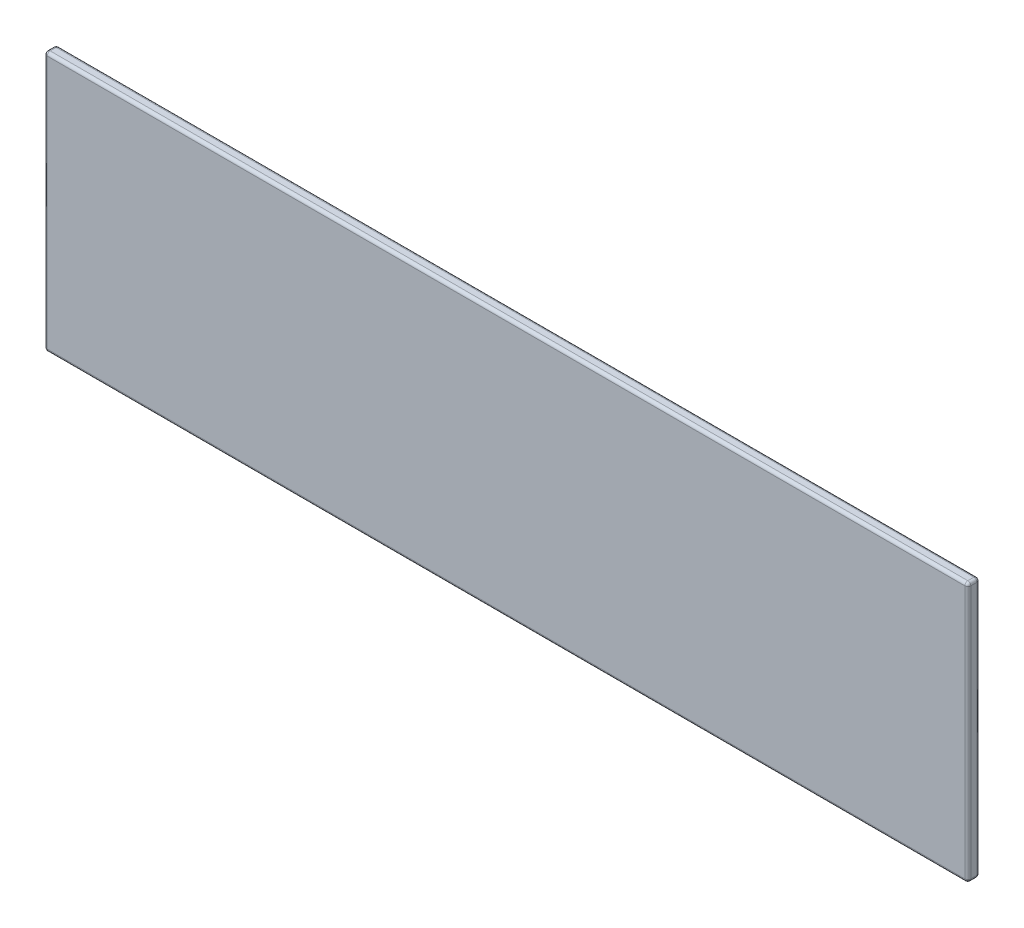
ISO-10303-21;
HEADER;
FILE_DESCRIPTION(('STEP AP214'),'2;1');
FILE_NAME('part.step','',(''),(''),'','','');
FILE_SCHEMA(('AUTOMOTIVE_DESIGN { 1 0 10303 214 1 1 1 1 }'));
ENDSEC;
DATA;
#1=APPLICATION_CONTEXT('core data for automotive mechanical design processes');
#2=APPLICATION_PROTOCOL_DEFINITION('international standard','automotive_design',2000,#1);
#3=PRODUCT_CONTEXT('',#1,'mechanical');
#4=PRODUCT('Part','Part','',(#3));
#5=PRODUCT_RELATED_PRODUCT_CATEGORY('part','',(#4));
#6=PRODUCT_DEFINITION_FORMATION('','',#4);
#7=PRODUCT_DEFINITION_CONTEXT('part definition',#1,'design');
#8=PRODUCT_DEFINITION('design','',#6,#7);
#9=PRODUCT_DEFINITION_SHAPE('','',#8);
#10=(LENGTH_UNIT() NAMED_UNIT(*) SI_UNIT(.MILLI.,.METRE.));
#11=(NAMED_UNIT(*) PLANE_ANGLE_UNIT() SI_UNIT($,.RADIAN.));
#12=(NAMED_UNIT(*) SI_UNIT($,.STERADIAN.) SOLID_ANGLE_UNIT());
#13=UNCERTAINTY_MEASURE_WITH_UNIT(LENGTH_MEASURE(1.E-05),#10,'distance_accuracy_value','');
#14=(GEOMETRIC_REPRESENTATION_CONTEXT(3) GLOBAL_UNCERTAINTY_ASSIGNED_CONTEXT((#13)) GLOBAL_UNIT_ASSIGNED_CONTEXT((#10,
#11,#12)) REPRESENTATION_CONTEXT('',''));
#15=CARTESIAN_POINT('',(0.,0.,0.));
#16=DIRECTION('',(0.,0.,1.));
#17=DIRECTION('',(1.,0.,0.));
#18=AXIS2_PLACEMENT_3D('',#15,#16,#17);
#19=CARTESIAN_POINT('',(77.35,-21.75,2.));
#20=DIRECTION('',(-1.,0.,0.));
#21=DIRECTION('',(0.,0.,1.));
#22=AXIS2_PLACEMENT_3D('',#19,#20,#21);
#23=PLANE('',#22);
#24=DIRECTION('',(0.,1.,0.));
#25=VECTOR('',#24,1.);
#26=CARTESIAN_POINT('',(77.35,-21.75,1.5));
#27=LINE('',#26,#25);
#28=CARTESIAN_POINT('',(77.35,21.25,1.5));
#29=VERTEX_POINT('',#28);
#30=CARTESIAN_POINT('',(77.35,-21.25,1.5));
#31=VERTEX_POINT('',#30);
#32=EDGE_CURVE('E42',#29,#31,#27,.F.);
#33=ORIENTED_EDGE('',*,*,#32,.T.);
#34=DIRECTION('',(0.,0.,-1.));
#35=VECTOR('',#34,1.);
#36=CARTESIAN_POINT('',(77.35,-21.25,2.));
#37=LINE('',#36,#35);
#38=CARTESIAN_POINT('',(77.35,-21.25,0.5));
#39=VERTEX_POINT('',#38);
#40=EDGE_CURVE('E11',#31,#39,#37,.T.);
#41=ORIENTED_EDGE('',*,*,#40,.T.);
#42=DIRECTION('',(0.,1.,0.));
#43=VECTOR('',#42,1.);
#44=CARTESIAN_POINT('',(77.35,21.75,0.5));
#45=LINE('',#44,#43);
#46=CARTESIAN_POINT('',(77.35,21.25,0.5));
#47=VERTEX_POINT('',#46);
#48=EDGE_CURVE('E194',#39,#47,#45,.T.);
#49=ORIENTED_EDGE('',*,*,#48,.T.);
#50=DIRECTION('',(0.,0.,-1.));
#51=VECTOR('',#50,1.);
#52=CARTESIAN_POINT('',(77.35,21.25,2.));
#53=LINE('',#52,#51);
#54=EDGE_CURVE('E53',#47,#29,#53,.F.);
#55=ORIENTED_EDGE('',*,*,#54,.T.);
#56=EDGE_LOOP('',(#33,#41,#49,#55));
#57=FACE_BOUND('',#56,.T.);
#58=ADVANCED_FACE('F33',(#57),#23,.F.);
#59=CARTESIAN_POINT('',(-77.35,21.75,2.));
#60=DIRECTION('',(0.,-1.,0.));
#61=DIRECTION('',(0.,0.,-1.));
#62=AXIS2_PLACEMENT_3D('',#59,#60,#61);
#63=PLANE('',#62);
#64=DIRECTION('',(0.,0.,-1.));
#65=VECTOR('',#64,1.);
#66=CARTESIAN_POINT('',(-76.85,21.75,2.));
#67=LINE('',#66,#65);
#68=CARTESIAN_POINT('',(-76.85,21.75,0.5));
#69=VERTEX_POINT('',#68);
#70=CARTESIAN_POINT('',(-76.85,21.75,1.5));
#71=VERTEX_POINT('',#70);
#72=EDGE_CURVE('E189',#69,#71,#67,.F.);
#73=ORIENTED_EDGE('',*,*,#72,.T.);
#74=DIRECTION('',(-1.,0.,0.));
#75=VECTOR('',#74,1.);
#76=CARTESIAN_POINT('',(-77.35,21.75,1.5));
#77=LINE('',#76,#75);
#78=CARTESIAN_POINT('',(76.85,21.75,1.5));
#79=VERTEX_POINT('',#78);
#80=EDGE_CURVE('E191',#71,#79,#77,.F.);
#81=ORIENTED_EDGE('',*,*,#80,.T.);
#82=DIRECTION('',(0.,0.,-1.));
#83=VECTOR('',#82,1.);
#84=CARTESIAN_POINT('',(76.85,21.75,2.));
#85=LINE('',#84,#83);
#86=CARTESIAN_POINT('',(76.85,21.75,0.5));
#87=VERTEX_POINT('',#86);
#88=EDGE_CURVE('E185',#79,#87,#85,.T.);
#89=ORIENTED_EDGE('',*,*,#88,.T.);
#90=DIRECTION('',(-1.,0.,0.));
#91=VECTOR('',#90,1.);
#92=CARTESIAN_POINT('',(-77.35,21.75,0.5));
#93=LINE('',#92,#91);
#94=EDGE_CURVE('E187',#87,#69,#93,.T.);
#95=ORIENTED_EDGE('',*,*,#94,.T.);
#96=EDGE_LOOP('',(#73,#81,#89,#95));
#97=FACE_BOUND('',#96,.T.);
#98=ADVANCED_FACE('F278',(#97),#63,.F.);
#99=CARTESIAN_POINT('',(-77.35,-21.75,2.));
#100=DIRECTION('',(1.,0.,0.));
#101=DIRECTION('',(0.,0.,-1.));
#102=AXIS2_PLACEMENT_3D('',#99,#100,#101);
#103=PLANE('',#102);
#104=DIRECTION('',(0.,0.,-1.));
#105=VECTOR('',#104,1.);
#106=CARTESIAN_POINT('',(-77.35,-21.25,2.));
#107=LINE('',#106,#105);
#108=CARTESIAN_POINT('',(-77.35,-21.25,0.5));
#109=VERTEX_POINT('',#108);
#110=CARTESIAN_POINT('',(-77.35,-21.25,1.5));
#111=VERTEX_POINT('',#110);
#112=EDGE_CURVE('E180',#109,#111,#107,.F.);
#113=ORIENTED_EDGE('',*,*,#112,.T.);
#114=DIRECTION('',(0.,-1.,0.));
#115=VECTOR('',#114,1.);
#116=CARTESIAN_POINT('',(-77.35,-21.75,1.5));
#117=LINE('',#116,#115);
#118=CARTESIAN_POINT('',(-77.35,21.25,1.5));
#119=VERTEX_POINT('',#118);
#120=EDGE_CURVE('E182',#111,#119,#117,.F.);
#121=ORIENTED_EDGE('',*,*,#120,.T.);
#122=DIRECTION('',(0.,0.,-1.));
#123=VECTOR('',#122,1.);
#124=CARTESIAN_POINT('',(-77.35,21.25,2.));
#125=LINE('',#124,#123);
#126=CARTESIAN_POINT('',(-77.35,21.25,0.5));
#127=VERTEX_POINT('',#126);
#128=EDGE_CURVE('E176',#119,#127,#125,.T.);
#129=ORIENTED_EDGE('',*,*,#128,.T.);
#130=DIRECTION('',(0.,-1.,0.));
#131=VECTOR('',#130,1.);
#132=CARTESIAN_POINT('',(-77.35,-21.75,0.5));
#133=LINE('',#132,#131);
#134=EDGE_CURVE('E178',#127,#109,#133,.T.);
#135=ORIENTED_EDGE('',*,*,#134,.T.);
#136=EDGE_LOOP('',(#113,#121,#129,#135));
#137=FACE_BOUND('',#136,.T.);
#138=ADVANCED_FACE('F269',(#137),#103,.F.);
#139=CARTESIAN_POINT('',(-77.35,-21.75,2.));
#140=DIRECTION('',(0.,1.,0.));
#141=DIRECTION('',(0.,0.,1.));
#142=AXIS2_PLACEMENT_3D('',#139,#140,#141);
#143=PLANE('',#142);
#144=DIRECTION('',(1.,0.,0.));
#145=VECTOR('',#144,1.);
#146=CARTESIAN_POINT('',(-77.35,-21.75,1.5));
#147=LINE('',#146,#145);
#148=CARTESIAN_POINT('',(76.85,-21.75,1.5));
#149=VERTEX_POINT('',#148);
#150=CARTESIAN_POINT('',(-76.85,-21.75,1.5));
#151=VERTEX_POINT('',#150);
#152=EDGE_CURVE('E129',#149,#151,#147,.F.);
#153=ORIENTED_EDGE('',*,*,#152,.T.);
#154=DIRECTION('',(0.,0.,-1.));
#155=VECTOR('',#154,1.);
#156=CARTESIAN_POINT('',(-76.85,-21.75,2.));
#157=LINE('',#156,#155);
#158=CARTESIAN_POINT('',(-76.85,-21.75,0.5));
#159=VERTEX_POINT('',#158);
#160=EDGE_CURVE('E165',#151,#159,#157,.T.);
#161=ORIENTED_EDGE('',*,*,#160,.T.);
#162=DIRECTION('',(1.,0.,0.));
#163=VECTOR('',#162,1.);
#164=CARTESIAN_POINT('',(77.35,-21.75,0.5));
#165=LINE('',#164,#163);
#166=CARTESIAN_POINT('',(76.85,-21.75,0.5));
#167=VERTEX_POINT('',#166);
#168=EDGE_CURVE('E158',#159,#167,#165,.T.);
#169=ORIENTED_EDGE('',*,*,#168,.T.);
#170=DIRECTION('',(0.,0.,-1.));
#171=VECTOR('',#170,1.);
#172=CARTESIAN_POINT('',(76.85,-21.75,2.));
#173=LINE('',#172,#171);
#174=EDGE_CURVE('E156',#167,#149,#173,.F.);
#175=ORIENTED_EDGE('',*,*,#174,.T.);
#176=EDGE_LOOP('',(#153,#161,#169,#175));
#177=FACE_BOUND('',#176,.T.);
#178=ADVANCED_FACE('F356',(#177),#143,.F.);
#179=CARTESIAN_POINT('',(0.,0.,2.));
#180=DIRECTION('',(0.,0.,-1.));
#181=DIRECTION('',(-1.,0.,0.));
#182=AXIS2_PLACEMENT_3D('',#179,#180,#181);
#183=PLANE('',#182);
#184=DIRECTION('',(0.,-1.,0.));
#185=VECTOR('',#184,1.);
#186=CARTESIAN_POINT('',(-76.85,0.,2.));
#187=LINE('',#186,#185);
#188=CARTESIAN_POINT('',(-76.85,21.25,2.));
#189=VERTEX_POINT('',#188);
#190=CARTESIAN_POINT('',(-76.85,-21.25,2.));
#191=VERTEX_POINT('',#190);
#192=EDGE_CURVE('E154',#189,#191,#187,.T.);
#193=ORIENTED_EDGE('',*,*,#192,.T.);
#194=DIRECTION('',(1.,0.,0.));
#195=VECTOR('',#194,1.);
#196=CARTESIAN_POINT('',(0.,-21.25,2.));
#197=LINE('',#196,#195);
#198=CARTESIAN_POINT('',(76.85,-21.25,2.));
#199=VERTEX_POINT('',#198);
#200=EDGE_CURVE('E127',#191,#199,#197,.T.);
#201=ORIENTED_EDGE('',*,*,#200,.T.);
#202=DIRECTION('',(0.,1.,0.));
#203=VECTOR('',#202,1.);
#204=CARTESIAN_POINT('',(76.85,0.,2.));
#205=LINE('',#204,#203);
#206=CARTESIAN_POINT('',(76.85,21.25,2.));
#207=VERTEX_POINT('',#206);
#208=EDGE_CURVE('E144',#199,#207,#205,.T.);
#209=ORIENTED_EDGE('',*,*,#208,.T.);
#210=DIRECTION('',(-1.,0.,0.));
#211=VECTOR('',#210,1.);
#212=CARTESIAN_POINT('',(0.,21.25,2.));
#213=LINE('',#212,#211);
#214=EDGE_CURVE('E150',#207,#189,#213,.T.);
#215=ORIENTED_EDGE('',*,*,#214,.T.);
#216=EDGE_LOOP('',(#193,#201,#209,#215));
#217=FACE_BOUND('',#216,.T.);
#218=ADVANCED_FACE('F152',(#217),#183,.F.);
#219=CARTESIAN_POINT('',(0.,0.,0.));
#220=DIRECTION('',(0.,0.,-1.));
#221=DIRECTION('',(-1.,0.,0.));
#222=AXIS2_PLACEMENT_3D('',#219,#220,#221);
#223=PLANE('',#222);
#224=DIRECTION('',(0.,1.,0.));
#225=VECTOR('',#224,1.);
#226=CARTESIAN_POINT('',(76.85,-21.75,0.));
#227=LINE('',#226,#225);
#228=CARTESIAN_POINT('',(76.85,21.25,0.));
#229=VERTEX_POINT('',#228);
#230=CARTESIAN_POINT('',(76.85,-21.25,0.));
#231=VERTEX_POINT('',#230);
#232=EDGE_CURVE('E167',#229,#231,#227,.F.);
#233=ORIENTED_EDGE('',*,*,#232,.T.);
#234=DIRECTION('',(1.,0.,0.));
#235=VECTOR('',#234,1.);
#236=CARTESIAN_POINT('',(-77.35,-21.25,0.));
#237=LINE('',#236,#235);
#238=CARTESIAN_POINT('',(-76.85,-21.25,0.));
#239=VERTEX_POINT('',#238);
#240=EDGE_CURVE('E173',#231,#239,#237,.F.);
#241=ORIENTED_EDGE('',*,*,#240,.T.);
#242=DIRECTION('',(0.,-1.,0.));
#243=VECTOR('',#242,1.);
#244=CARTESIAN_POINT('',(-76.85,21.75,0.));
#245=LINE('',#244,#243);
#246=CARTESIAN_POINT('',(-76.85,21.25,0.));
#247=VERTEX_POINT('',#246);
#248=EDGE_CURVE('E171',#239,#247,#245,.F.);
#249=ORIENTED_EDGE('',*,*,#248,.T.);
#250=DIRECTION('',(-1.,0.,0.));
#251=VECTOR('',#250,1.);
#252=CARTESIAN_POINT('',(77.35,21.25,0.));
#253=LINE('',#252,#251);
#254=EDGE_CURVE('E169',#247,#229,#253,.F.);
#255=ORIENTED_EDGE('',*,*,#254,.T.);
#256=EDGE_LOOP('',(#233,#241,#249,#255));
#257=FACE_BOUND('',#256,.T.);
#258=ADVANCED_FACE('F296',(#257),#223,.T.);
#259=CARTESIAN_POINT('',(-77.35,21.25,0.5));
#260=DIRECTION('',(1.,0.,0.));
#261=DIRECTION('',(0.,0.,-1.));
#262=AXIS2_PLACEMENT_3D('',#259,#260,#261);
#263=CYLINDRICAL_SURFACE('',#262,0.5);
#264=CARTESIAN_POINT('',(-76.85,21.25,0.5));
#265=DIRECTION('',(-1.,0.,0.));
#266=DIRECTION('',(0.,0.,1.));
#267=AXIS2_PLACEMENT_3D('',#264,#265,#266);
#268=CIRCLE('',#267,0.5);
#269=EDGE_CURVE('E37',#69,#247,#268,.T.);
#270=ORIENTED_EDGE('',*,*,#269,.F.);
#271=ORIENTED_EDGE('',*,*,#94,.F.);
#272=CARTESIAN_POINT('',(76.85,21.25,0.5));
#273=DIRECTION('',(1.,0.,0.));
#274=DIRECTION('',(0.,0.,-1.));
#275=AXIS2_PLACEMENT_3D('',#272,#273,#274);
#276=CIRCLE('',#275,0.5);
#277=EDGE_CURVE('E246',#229,#87,#276,.T.);
#278=ORIENTED_EDGE('',*,*,#277,.F.);
#279=ORIENTED_EDGE('',*,*,#254,.F.);
#280=EDGE_LOOP('',(#270,#271,#278,#279));
#281=FACE_BOUND('',#280,.T.);
#282=ADVANCED_FACE('F35',(#281),#263,.T.);
#283=CARTESIAN_POINT('',(-76.85,21.25,0.5));
#284=DIRECTION('',(0.,0.,1.));
#285=DIRECTION('',(1.,0.,0.));
#286=AXIS2_PLACEMENT_3D('',#283,#284,#285);
#287=SPHERICAL_SURFACE('',#286,0.5);
#288=CARTESIAN_POINT('',(-76.85,21.25,0.5));
#289=DIRECTION('',(0.,0.,-1.));
#290=DIRECTION('',(-1.,0.,0.));
#291=AXIS2_PLACEMENT_3D('',#288,#289,#290);
#292=CIRCLE('',#291,0.5);
#293=EDGE_CURVE('E241',#69,#127,#292,.F.);
#294=ORIENTED_EDGE('',*,*,#293,.F.);
#295=ORIENTED_EDGE('',*,*,#269,.T.);
#296=CARTESIAN_POINT('',(-76.85,21.25,0.5));
#297=DIRECTION('',(0.,1.,0.));
#298=DIRECTION('',(0.,0.,1.));
#299=AXIS2_PLACEMENT_3D('',#296,#297,#298);
#300=CIRCLE('',#299,0.5);
#301=EDGE_CURVE('E244',#127,#247,#300,.F.);
#302=ORIENTED_EDGE('',*,*,#301,.F.);
#303=EDGE_LOOP('',(#294,#295,#302));
#304=FACE_BOUND('',#303,.T.);
#305=ADVANCED_FACE('F257',(#304),#287,.T.);
#306=CARTESIAN_POINT('',(76.85,21.25,0.5));
#307=DIRECTION('',(0.,0.,1.));
#308=DIRECTION('',(1.,0.,0.));
#309=AXIS2_PLACEMENT_3D('',#306,#307,#308);
#310=SPHERICAL_SURFACE('',#309,0.5);
#311=CARTESIAN_POINT('',(76.85,21.25,0.5));
#312=DIRECTION('',(0.,1.,0.));
#313=DIRECTION('',(0.,0.,1.));
#314=AXIS2_PLACEMENT_3D('',#311,#312,#313);
#315=CIRCLE('',#314,0.5);
#316=EDGE_CURVE('E235',#229,#47,#315,.F.);
#317=ORIENTED_EDGE('',*,*,#316,.F.);
#318=ORIENTED_EDGE('',*,*,#277,.T.);
#319=CARTESIAN_POINT('',(76.85,21.25,0.5));
#320=DIRECTION('',(0.,0.,-1.));
#321=DIRECTION('',(-1.,0.,0.));
#322=AXIS2_PLACEMENT_3D('',#319,#320,#321);
#323=CIRCLE('',#322,0.5);
#324=EDGE_CURVE('E238',#47,#87,#323,.F.);
#325=ORIENTED_EDGE('',*,*,#324,.F.);
#326=EDGE_LOOP('',(#317,#318,#325));
#327=FACE_BOUND('',#326,.T.);
#328=ADVANCED_FACE('F289',(#327),#310,.T.);
#329=CARTESIAN_POINT('',(-76.85,-21.75,0.5));
#330=DIRECTION('',(0.,1.,0.));
#331=DIRECTION('',(0.,0.,1.));
#332=AXIS2_PLACEMENT_3D('',#329,#330,#331);
#333=CYLINDRICAL_SURFACE('',#332,0.5);
#334=ORIENTED_EDGE('',*,*,#301,.T.);
#335=ORIENTED_EDGE('',*,*,#248,.F.);
#336=CARTESIAN_POINT('',(-76.85,-21.25,0.5));
#337=DIRECTION('',(0.,-1.,0.));
#338=DIRECTION('',(0.,0.,-1.));
#339=AXIS2_PLACEMENT_3D('',#336,#337,#338);
#340=CIRCLE('',#339,0.5);
#341=EDGE_CURVE('E230',#109,#239,#340,.T.);
#342=ORIENTED_EDGE('',*,*,#341,.F.);
#343=ORIENTED_EDGE('',*,*,#134,.F.);
#344=EDGE_LOOP('',(#334,#335,#342,#343));
#345=FACE_BOUND('',#344,.T.);
#346=ADVANCED_FACE('F265',(#345),#333,.T.);
#347=CARTESIAN_POINT('',(-76.85,21.25,2.));
#348=DIRECTION('',(0.,0.,-1.));
#349=DIRECTION('',(-1.,0.,0.));
#350=AXIS2_PLACEMENT_3D('',#347,#348,#349);
#351=CYLINDRICAL_SURFACE('',#350,0.5);
#352=ORIENTED_EDGE('',*,*,#293,.T.);
#353=ORIENTED_EDGE('',*,*,#128,.F.);
#354=CARTESIAN_POINT('',(-76.85,21.25,1.5));
#355=DIRECTION('',(0.,0.,1.));
#356=DIRECTION('',(1.,0.,0.));
#357=AXIS2_PLACEMENT_3D('',#354,#355,#356);
#358=CIRCLE('',#357,0.5);
#359=EDGE_CURVE('E227',#71,#119,#358,.T.);
#360=ORIENTED_EDGE('',*,*,#359,.F.);
#361=ORIENTED_EDGE('',*,*,#72,.F.);
#362=EDGE_LOOP('',(#352,#353,#360,#361));
#363=FACE_BOUND('',#362,.T.);
#364=ADVANCED_FACE('F275',(#363),#351,.T.);
#365=CARTESIAN_POINT('',(0.,21.25,1.5));
#366=DIRECTION('',(-1.,0.,0.));
#367=DIRECTION('',(0.,0.,1.));
#368=AXIS2_PLACEMENT_3D('',#365,#366,#367);
#369=CYLINDRICAL_SURFACE('',#368,0.5);
#370=CARTESIAN_POINT('',(76.85,21.25,1.5));
#371=DIRECTION('',(1.,0.,0.));
#372=DIRECTION('',(0.,0.,-1.));
#373=AXIS2_PLACEMENT_3D('',#370,#371,#372);
#374=CIRCLE('',#373,0.5);
#375=EDGE_CURVE('E221',#79,#207,#374,.T.);
#376=ORIENTED_EDGE('',*,*,#375,.F.);
#377=ORIENTED_EDGE('',*,*,#80,.F.);
#378=CARTESIAN_POINT('',(-76.85,21.25,1.5));
#379=DIRECTION('',(-1.,0.,0.));
#380=DIRECTION('',(0.,0.,1.));
#381=AXIS2_PLACEMENT_3D('',#378,#379,#380);
#382=CIRCLE('',#381,0.5);
#383=EDGE_CURVE('E224',#189,#71,#382,.T.);
#384=ORIENTED_EDGE('',*,*,#383,.F.);
#385=ORIENTED_EDGE('',*,*,#214,.F.);
#386=EDGE_LOOP('',(#376,#377,#384,#385));
#387=FACE_BOUND('',#386,.T.);
#388=ADVANCED_FACE('F282',(#387),#369,.T.);
#389=CARTESIAN_POINT('',(76.85,21.25,2.));
#390=DIRECTION('',(0.,0.,-1.));
#391=DIRECTION('',(-1.,0.,0.));
#392=AXIS2_PLACEMENT_3D('',#389,#390,#391);
#393=CYLINDRICAL_SURFACE('',#392,0.5);
#394=ORIENTED_EDGE('',*,*,#324,.T.);
#395=ORIENTED_EDGE('',*,*,#88,.F.);
#396=CARTESIAN_POINT('',(76.85,21.25,1.5));
#397=DIRECTION('',(0.,0.,1.));
#398=DIRECTION('',(1.,0.,0.));
#399=AXIS2_PLACEMENT_3D('',#396,#397,#398);
#400=CIRCLE('',#399,0.5);
#401=EDGE_CURVE('E219',#29,#79,#400,.T.);
#402=ORIENTED_EDGE('',*,*,#401,.F.);
#403=ORIENTED_EDGE('',*,*,#54,.F.);
#404=EDGE_LOOP('',(#394,#395,#402,#403));
#405=FACE_BOUND('',#404,.T.);
#406=ADVANCED_FACE('F287',(#405),#393,.T.);
#407=CARTESIAN_POINT('',(76.85,-21.75,0.5));
#408=DIRECTION('',(0.,-1.,0.));
#409=DIRECTION('',(0.,0.,-1.));
#410=AXIS2_PLACEMENT_3D('',#407,#408,#409);
#411=CYLINDRICAL_SURFACE('',#410,0.5);
#412=ORIENTED_EDGE('',*,*,#316,.T.);
#413=ORIENTED_EDGE('',*,*,#48,.F.);
#414=CARTESIAN_POINT('',(76.85,-21.25,0.5));
#415=DIRECTION('',(0.,-1.,0.));
#416=DIRECTION('',(0.,0.,-1.));
#417=AXIS2_PLACEMENT_3D('',#414,#415,#416);
#418=CIRCLE('',#417,0.5);
#419=EDGE_CURVE('E216',#231,#39,#418,.T.);
#420=ORIENTED_EDGE('',*,*,#419,.F.);
#421=ORIENTED_EDGE('',*,*,#232,.F.);
#422=EDGE_LOOP('',(#412,#413,#420,#421));
#423=FACE_BOUND('',#422,.T.);
#424=ADVANCED_FACE('F293',(#423),#411,.T.);
#425=CARTESIAN_POINT('',(-77.35,-21.25,0.5));
#426=DIRECTION('',(-1.,0.,0.));
#427=DIRECTION('',(0.,0.,1.));
#428=AXIS2_PLACEMENT_3D('',#425,#426,#427);
#429=CYLINDRICAL_SURFACE('',#428,0.5);
#430=CARTESIAN_POINT('',(-76.85,-21.25,0.5));
#431=DIRECTION('',(-1.,0.,0.));
#432=DIRECTION('',(0.,0.,1.));
#433=AXIS2_PLACEMENT_3D('',#430,#431,#432);
#434=CIRCLE('',#433,0.5);
#435=EDGE_CURVE('E232',#239,#159,#434,.T.);
#436=ORIENTED_EDGE('',*,*,#435,.F.);
#437=ORIENTED_EDGE('',*,*,#240,.F.);
#438=CARTESIAN_POINT('',(76.85,-21.25,0.5));
#439=DIRECTION('',(1.,0.,0.));
#440=DIRECTION('',(0.,0.,-1.));
#441=AXIS2_PLACEMENT_3D('',#438,#439,#440);
#442=CIRCLE('',#441,0.5);
#443=EDGE_CURVE('E213',#167,#231,#442,.T.);
#444=ORIENTED_EDGE('',*,*,#443,.F.);
#445=ORIENTED_EDGE('',*,*,#168,.F.);
#446=EDGE_LOOP('',(#436,#437,#444,#445));
#447=FACE_BOUND('',#446,.T.);
#448=ADVANCED_FACE('F300',(#447),#429,.T.);
#449=CARTESIAN_POINT('',(-76.85,-21.25,0.5));
#450=DIRECTION('',(0.,0.,1.));
#451=DIRECTION('',(1.,0.,0.));
#452=AXIS2_PLACEMENT_3D('',#449,#450,#451);
#453=SPHERICAL_SURFACE('',#452,0.5);
#454=ORIENTED_EDGE('',*,*,#341,.T.);
#455=ORIENTED_EDGE('',*,*,#435,.T.);
#456=CARTESIAN_POINT('',(-76.85,-21.25,0.5));
#457=DIRECTION('',(0.,0.,-1.));
#458=DIRECTION('',(-1.,0.,0.));
#459=AXIS2_PLACEMENT_3D('',#456,#457,#458);
#460=CIRCLE('',#459,0.5);
#461=EDGE_CURVE('E210',#109,#159,#460,.F.);
#462=ORIENTED_EDGE('',*,*,#461,.F.);
#463=EDGE_LOOP('',(#454,#455,#462));
#464=FACE_BOUND('',#463,.T.);
#465=ADVANCED_FACE('F304',(#464),#453,.T.);
#466=CARTESIAN_POINT('',(-76.85,21.25,1.5));
#467=DIRECTION('',(0.,0.,1.));
#468=DIRECTION('',(1.,0.,0.));
#469=AXIS2_PLACEMENT_3D('',#466,#467,#468);
#470=SPHERICAL_SURFACE('',#469,0.5);
#471=ORIENTED_EDGE('',*,*,#383,.T.);
#472=ORIENTED_EDGE('',*,*,#359,.T.);
#473=CARTESIAN_POINT('',(-76.85,21.25,1.5));
#474=DIRECTION('',(0.,1.,0.));
#475=DIRECTION('',(0.,0.,1.));
#476=AXIS2_PLACEMENT_3D('',#473,#474,#475);
#477=CIRCLE('',#476,0.5);
#478=EDGE_CURVE('E208',#189,#119,#477,.F.);
#479=ORIENTED_EDGE('',*,*,#478,.F.);
#480=EDGE_LOOP('',(#471,#472,#479));
#481=FACE_BOUND('',#480,.T.);
#482=ADVANCED_FACE('F315',(#481),#470,.T.);
#483=CARTESIAN_POINT('',(76.85,21.25,1.5));
#484=DIRECTION('',(0.,0.,1.));
#485=DIRECTION('',(1.,0.,0.));
#486=AXIS2_PLACEMENT_3D('',#483,#484,#485);
#487=SPHERICAL_SURFACE('',#486,0.5);
#488=ORIENTED_EDGE('',*,*,#401,.T.);
#489=ORIENTED_EDGE('',*,*,#375,.T.);
#490=CARTESIAN_POINT('',(76.85,21.25,1.5));
#491=DIRECTION('',(0.,1.,0.));
#492=DIRECTION('',(0.,0.,1.));
#493=AXIS2_PLACEMENT_3D('',#490,#491,#492);
#494=CIRCLE('',#493,0.5);
#495=EDGE_CURVE('E147',#29,#207,#494,.F.);
#496=ORIENTED_EDGE('',*,*,#495,.F.);
#497=EDGE_LOOP('',(#488,#489,#496));
#498=FACE_BOUND('',#497,.T.);
#499=ADVANCED_FACE('F317',(#498),#487,.T.);
#500=CARTESIAN_POINT('',(76.85,-21.25,0.5));
#501=DIRECTION('',(0.,0.,1.));
#502=DIRECTION('',(1.,0.,0.));
#503=AXIS2_PLACEMENT_3D('',#500,#501,#502);
#504=SPHERICAL_SURFACE('',#503,0.5);
#505=ORIENTED_EDGE('',*,*,#443,.T.);
#506=ORIENTED_EDGE('',*,*,#419,.T.);
#507=CARTESIAN_POINT('',(76.85,-21.25,0.5));
#508=DIRECTION('',(0.,0.,-1.));
#509=DIRECTION('',(-1.,0.,0.));
#510=AXIS2_PLACEMENT_3D('',#507,#508,#509);
#511=CIRCLE('',#510,0.5);
#512=EDGE_CURVE('E205',#167,#39,#511,.F.);
#513=ORIENTED_EDGE('',*,*,#512,.F.);
#514=EDGE_LOOP('',(#505,#506,#513));
#515=FACE_BOUND('',#514,.T.);
#516=ADVANCED_FACE('F323',(#515),#504,.T.);
#517=CARTESIAN_POINT('',(-76.85,-21.25,2.));
#518=DIRECTION('',(0.,0.,-1.));
#519=DIRECTION('',(-1.,0.,0.));
#520=AXIS2_PLACEMENT_3D('',#517,#518,#519);
#521=CYLINDRICAL_SURFACE('',#520,0.5);
#522=ORIENTED_EDGE('',*,*,#461,.T.);
#523=ORIENTED_EDGE('',*,*,#160,.F.);
#524=CARTESIAN_POINT('',(-76.85,-21.25,1.5));
#525=DIRECTION('',(0.,0.,1.));
#526=DIRECTION('',(1.,0.,0.));
#527=AXIS2_PLACEMENT_3D('',#524,#525,#526);
#528=CIRCLE('',#527,0.5);
#529=EDGE_CURVE('E202',#111,#151,#528,.T.);
#530=ORIENTED_EDGE('',*,*,#529,.F.);
#531=ORIENTED_EDGE('',*,*,#112,.F.);
#532=EDGE_LOOP('',(#522,#523,#530,#531));
#533=FACE_BOUND('',#532,.T.);
#534=ADVANCED_FACE('F307',(#533),#521,.T.);
#535=CARTESIAN_POINT('',(-76.85,0.,1.5));
#536=DIRECTION('',(0.,-1.,0.));
#537=DIRECTION('',(0.,0.,-1.));
#538=AXIS2_PLACEMENT_3D('',#535,#536,#537);
#539=CYLINDRICAL_SURFACE('',#538,0.5);
#540=ORIENTED_EDGE('',*,*,#478,.T.);
#541=ORIENTED_EDGE('',*,*,#120,.F.);
#542=CARTESIAN_POINT('',(-76.85,-21.25,1.5));
#543=DIRECTION('',(0.,-1.,0.));
#544=DIRECTION('',(0.,0.,-1.));
#545=AXIS2_PLACEMENT_3D('',#542,#543,#544);
#546=CIRCLE('',#545,0.5);
#547=EDGE_CURVE('E141',#191,#111,#546,.T.);
#548=ORIENTED_EDGE('',*,*,#547,.F.);
#549=ORIENTED_EDGE('',*,*,#192,.F.);
#550=EDGE_LOOP('',(#540,#541,#548,#549));
#551=FACE_BOUND('',#550,.T.);
#552=ADVANCED_FACE('F313',(#551),#539,.T.);
#553=CARTESIAN_POINT('',(76.85,0.,1.5));
#554=DIRECTION('',(0.,1.,0.));
#555=DIRECTION('',(0.,0.,1.));
#556=AXIS2_PLACEMENT_3D('',#553,#554,#555);
#557=CYLINDRICAL_SURFACE('',#556,0.5);
#558=ORIENTED_EDGE('',*,*,#495,.T.);
#559=ORIENTED_EDGE('',*,*,#208,.F.);
#560=CARTESIAN_POINT('',(76.85,-21.25,1.5));
#561=DIRECTION('',(0.,-1.,0.));
#562=DIRECTION('',(0.,0.,-1.));
#563=AXIS2_PLACEMENT_3D('',#560,#561,#562);
#564=CIRCLE('',#563,0.5);
#565=EDGE_CURVE('E135',#31,#199,#564,.T.);
#566=ORIENTED_EDGE('',*,*,#565,.F.);
#567=ORIENTED_EDGE('',*,*,#32,.F.);
#568=EDGE_LOOP('',(#558,#559,#566,#567));
#569=FACE_BOUND('',#568,.T.);
#570=ADVANCED_FACE('F145',(#569),#557,.T.);
#571=CARTESIAN_POINT('',(76.85,-21.25,2.));
#572=DIRECTION('',(0.,0.,-1.));
#573=DIRECTION('',(-1.,0.,0.));
#574=AXIS2_PLACEMENT_3D('',#571,#572,#573);
#575=CYLINDRICAL_SURFACE('',#574,0.5);
#576=ORIENTED_EDGE('',*,*,#512,.T.);
#577=ORIENTED_EDGE('',*,*,#40,.F.);
#578=CARTESIAN_POINT('',(76.85,-21.25,1.5));
#579=DIRECTION('',(0.,0.,1.));
#580=DIRECTION('',(1.,0.,0.));
#581=AXIS2_PLACEMENT_3D('',#578,#579,#580);
#582=CIRCLE('',#581,0.5);
#583=EDGE_CURVE('E139',#149,#31,#582,.T.);
#584=ORIENTED_EDGE('',*,*,#583,.F.);
#585=ORIENTED_EDGE('',*,*,#174,.F.);
#586=EDGE_LOOP('',(#576,#577,#584,#585));
#587=FACE_BOUND('',#586,.T.);
#588=ADVANCED_FACE('F340',(#587),#575,.T.);
#589=CARTESIAN_POINT('',(-76.85,-21.25,1.5));
#590=DIRECTION('',(0.,0.,1.));
#591=DIRECTION('',(1.,0.,0.));
#592=AXIS2_PLACEMENT_3D('',#589,#590,#591);
#593=SPHERICAL_SURFACE('',#592,0.5);
#594=ORIENTED_EDGE('',*,*,#547,.T.);
#595=ORIENTED_EDGE('',*,*,#529,.T.);
#596=CARTESIAN_POINT('',(-76.85,-21.25,1.5));
#597=DIRECTION('',(-1.,0.,0.));
#598=DIRECTION('',(0.,0.,1.));
#599=AXIS2_PLACEMENT_3D('',#596,#597,#598);
#600=CIRCLE('',#599,0.5);
#601=EDGE_CURVE('E132',#191,#151,#600,.F.);
#602=ORIENTED_EDGE('',*,*,#601,.F.);
#603=EDGE_LOOP('',(#594,#595,#602));
#604=FACE_BOUND('',#603,.T.);
#605=ADVANCED_FACE('F311',(#604),#593,.T.);
#606=CARTESIAN_POINT('',(76.85,-21.25,1.5));
#607=DIRECTION('',(0.,0.,1.));
#608=DIRECTION('',(1.,0.,0.));
#609=AXIS2_PLACEMENT_3D('',#606,#607,#608);
#610=SPHERICAL_SURFACE('',#609,0.5);
#611=ORIENTED_EDGE('',*,*,#583,.T.);
#612=ORIENTED_EDGE('',*,*,#565,.T.);
#613=CARTESIAN_POINT('',(76.85,-21.25,1.5));
#614=DIRECTION('',(1.,0.,0.));
#615=DIRECTION('',(0.,0.,-1.));
#616=AXIS2_PLACEMENT_3D('',#613,#614,#615);
#617=CIRCLE('',#616,0.5);
#618=EDGE_CURVE('E123',#149,#199,#617,.F.);
#619=ORIENTED_EDGE('',*,*,#618,.F.);
#620=EDGE_LOOP('',(#611,#612,#619));
#621=FACE_BOUND('',#620,.T.);
#622=ADVANCED_FACE('F137',(#621),#610,.T.);
#623=CARTESIAN_POINT('',(0.,-21.25,1.5));
#624=DIRECTION('',(1.,0.,0.));
#625=DIRECTION('',(0.,0.,-1.));
#626=AXIS2_PLACEMENT_3D('',#623,#624,#625);
#627=CYLINDRICAL_SURFACE('',#626,0.5);
#628=ORIENTED_EDGE('',*,*,#601,.T.);
#629=ORIENTED_EDGE('',*,*,#152,.F.);
#630=ORIENTED_EDGE('',*,*,#618,.T.);
#631=ORIENTED_EDGE('',*,*,#200,.F.);
#632=EDGE_LOOP('',(#628,#629,#630,#631));
#633=FACE_BOUND('',#632,.T.);
#634=ADVANCED_FACE('F125',(#633),#627,.T.);
#635=CLOSED_SHELL('',(#58,#98,#138,#178,#218,#258,#282,#305,#328,#346,#364,#388,#406,#424,#448,
#465,#482,#499,#516,#534,#552,#570,#588,#605,#622,#634));
#636=MANIFOLD_SOLID_BREP('B2',#635);
#637=ADVANCED_BREP_SHAPE_REPRESENTATION('',(#18,#636),#14);
#638=SHAPE_DEFINITION_REPRESENTATION(#9,#637);
ENDSEC;
END-ISO-10303-21;
